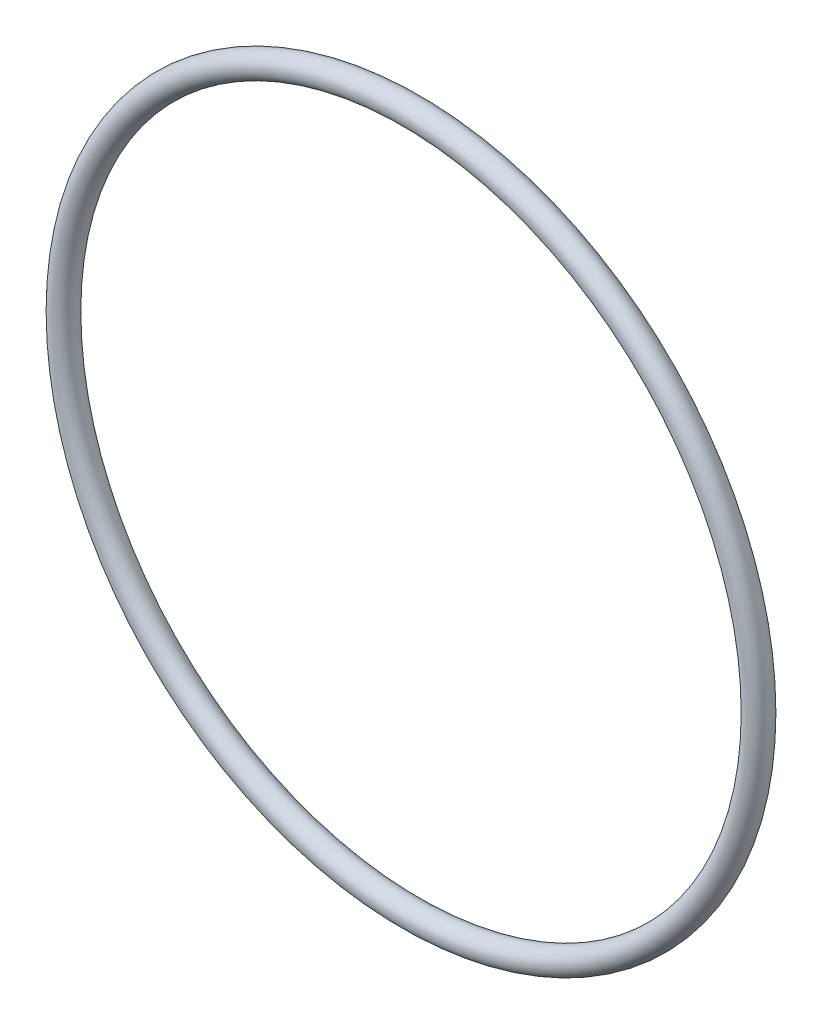
ISO-10303-21;
HEADER;
FILE_DESCRIPTION(('STEP AP214'),'2;1');
FILE_NAME('part.step','',(''),(''),'','','');
FILE_SCHEMA(('AUTOMOTIVE_DESIGN { 1 0 10303 214 1 1 1 1 }'));
ENDSEC;
DATA;
#1=APPLICATION_CONTEXT('core data for automotive mechanical design processes');
#2=APPLICATION_PROTOCOL_DEFINITION('international standard','automotive_design',2000,#1);
#3=PRODUCT_CONTEXT('',#1,'mechanical');
#4=PRODUCT('Part','Part','',(#3));
#5=PRODUCT_RELATED_PRODUCT_CATEGORY('part','',(#4));
#6=PRODUCT_DEFINITION_FORMATION('','',#4);
#7=PRODUCT_DEFINITION_CONTEXT('part definition',#1,'design');
#8=PRODUCT_DEFINITION('design','',#6,#7);
#9=PRODUCT_DEFINITION_SHAPE('','',#8);
#10=(LENGTH_UNIT() NAMED_UNIT(*) SI_UNIT(.MILLI.,.METRE.));
#11=(NAMED_UNIT(*) PLANE_ANGLE_UNIT() SI_UNIT($,.RADIAN.));
#12=(NAMED_UNIT(*) SI_UNIT($,.STERADIAN.) SOLID_ANGLE_UNIT());
#13=UNCERTAINTY_MEASURE_WITH_UNIT(LENGTH_MEASURE(1.E-05),#10,'distance_accuracy_value','');
#14=(GEOMETRIC_REPRESENTATION_CONTEXT(3) GLOBAL_UNCERTAINTY_ASSIGNED_CONTEXT((#13)) GLOBAL_UNIT_ASSIGNED_CONTEXT((#10,
#11,#12)) REPRESENTATION_CONTEXT('',''));
#15=CARTESIAN_POINT('',(0.,0.,0.));
#16=DIRECTION('',(0.,0.,1.));
#17=DIRECTION('',(1.,0.,0.));
#18=AXIS2_PLACEMENT_3D('',#15,#16,#17);
#19=CARTESIAN_POINT('',(0.,0.,0.));
#20=DIRECTION('',(0.,0.,1.));
#21=DIRECTION('',(1.,0.,0.));
#22=AXIS2_PLACEMENT_3D('',#19,#20,#21);
#23=TOROIDAL_SURFACE('',#22,23.,0.812799999999999);
#24=CARTESIAN_POINT('',(23.,0.,0.));
#25=DIRECTION('',(0.,1.,0.));
#26=DIRECTION('',(-1.,0.,0.));
#27=AXIS2_PLACEMENT_3D('',#24,#25,#26);
#28=CIRCLE('',#27,0.812799999999999);
#29=CARTESIAN_POINT('',(23.8128,0.,0.));
#30=VERTEX_POINT('',#29);
#31=EDGE_CURVE('E11',#30,#30,#28,.T.);
#32=CARTESIAN_POINT('',(0.,0.,0.));
#33=DIRECTION('',(0.,0.,1.));
#34=DIRECTION('',(1.,0.,0.));
#35=AXIS2_PLACEMENT_3D('',#32,#33,#34);
#36=CIRCLE('',#35,23.8128);
#37=EDGE_CURVE('',#30,#30,#36,.T.);
#38=ORIENTED_EDGE('',*,*,#31,.T.);
#39=ORIENTED_EDGE('',*,*,#31,.F.);
#40=ORIENTED_EDGE('',*,*,#37,.T.);
#41=ORIENTED_EDGE('',*,*,#37,.F.);
#42=EDGE_LOOP('',(#38,#40,#39,#41));
#43=FACE_BOUND('',#42,.T.);
#44=ADVANCED_FACE('F49',(#43),#23,.T.);
#45=CLOSED_SHELL('',(#44));
#46=MANIFOLD_SOLID_BREP('B2',#45);
#47=ADVANCED_BREP_SHAPE_REPRESENTATION('',(#18,#46),#14);
#48=SHAPE_DEFINITION_REPRESENTATION(#9,#47);
ENDSEC;
END-ISO-10303-21;
